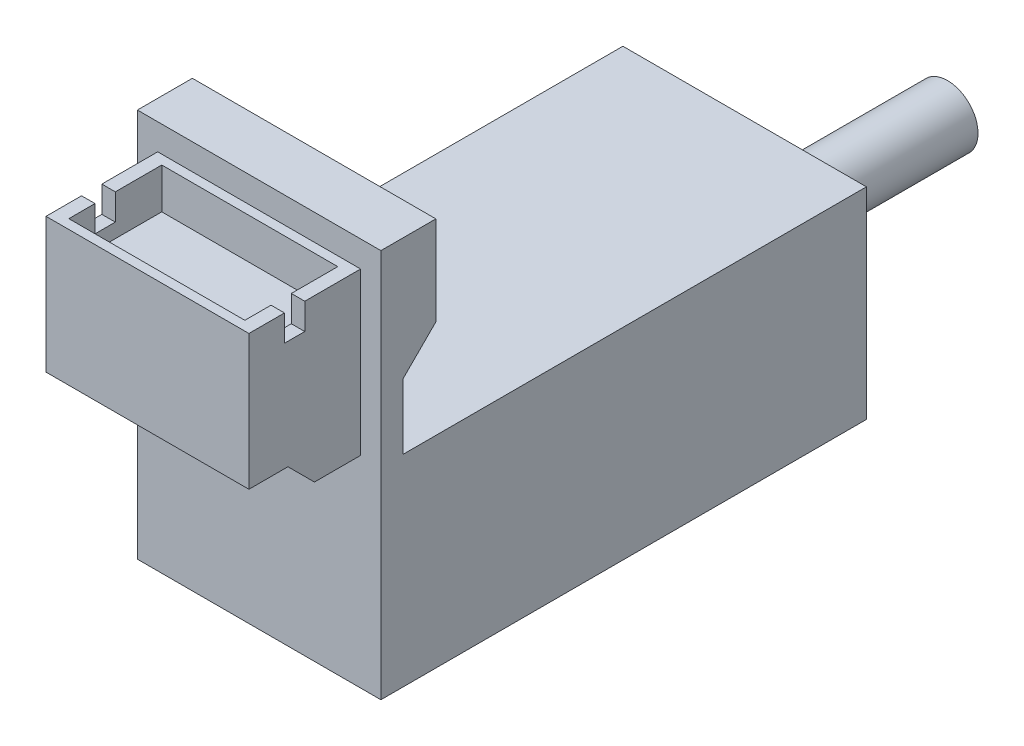
ISO-10303-21;
HEADER;
FILE_DESCRIPTION(('STEP AP214'),'2;1');
FILE_NAME('part.step','',(''),(''),'','','');
FILE_SCHEMA(('AUTOMOTIVE_DESIGN { 1 0 10303 214 1 1 1 1 }'));
ENDSEC;
DATA;
#1=APPLICATION_CONTEXT('core data for automotive mechanical design processes');
#2=APPLICATION_PROTOCOL_DEFINITION('international standard','automotive_design',2000,#1);
#3=PRODUCT_CONTEXT('',#1,'mechanical');
#4=PRODUCT('Part','Part','',(#3));
#5=PRODUCT_RELATED_PRODUCT_CATEGORY('part','',(#4));
#6=PRODUCT_DEFINITION_FORMATION('','',#4);
#7=PRODUCT_DEFINITION_CONTEXT('part definition',#1,'design');
#8=PRODUCT_DEFINITION('design','',#6,#7);
#9=PRODUCT_DEFINITION_SHAPE('','',#8);
#10=(LENGTH_UNIT() NAMED_UNIT(*) SI_UNIT(.MILLI.,.METRE.));
#11=(NAMED_UNIT(*) PLANE_ANGLE_UNIT() SI_UNIT($,.RADIAN.));
#12=(NAMED_UNIT(*) SI_UNIT($,.STERADIAN.) SOLID_ANGLE_UNIT());
#13=UNCERTAINTY_MEASURE_WITH_UNIT(LENGTH_MEASURE(1.E-05),#10,'distance_accuracy_value','');
#14=(GEOMETRIC_REPRESENTATION_CONTEXT(3) GLOBAL_UNCERTAINTY_ASSIGNED_CONTEXT((#13)) GLOBAL_UNIT_ASSIGNED_CONTEXT((#10,
#11,#12)) REPRESENTATION_CONTEXT('',''));
#15=CARTESIAN_POINT('',(0.,0.,0.));
#16=DIRECTION('',(0.,0.,1.));
#17=DIRECTION('',(1.,0.,0.));
#18=AXIS2_PLACEMENT_3D('',#15,#16,#17);
#19=CARTESIAN_POINT('',(0.,11.6277323625139,10.3020160923981));
#20=DIRECTION('',(0.,0.,-1.));
#21=DIRECTION('',(-1.,0.,0.));
#22=AXIS2_PLACEMENT_3D('',#19,#20,#21);
#23=PLANE('',#22);
#24=DIRECTION('',(1.,0.,0.));
#25=VECTOR('',#24,1.);
#26=CARTESIAN_POINT('',(0.,12.920980416334,10.3020160923981));
#27=LINE('',#26,#25);
#28=CARTESIAN_POINT('',(10.3374091666759,12.920980416334,10.3020160923981));
#29=VERTEX_POINT('',#28);
#30=CARTESIAN_POINT('',(11.,12.920980416334,10.3020160923981));
#31=VERTEX_POINT('',#30);
#32=EDGE_CURVE('E315',#29,#31,#27,.T.);
#33=ORIENTED_EDGE('',*,*,#32,.F.);
#34=DIRECTION('',(0.,-1.,0.));
#35=VECTOR('',#34,1.);
#36=CARTESIAN_POINT('',(10.3374091666759,11.6277323625139,10.3020160923981));
#37=LINE('',#36,#35);
#38=CARTESIAN_POINT('',(10.3374091666759,11.6277323625139,10.3020160923981));
#39=VERTEX_POINT('',#38);
#40=EDGE_CURVE('E295',#29,#39,#37,.T.);
#41=ORIENTED_EDGE('',*,*,#40,.T.);
#42=DIRECTION('',(1.,0.,0.));
#43=VECTOR('',#42,1.);
#44=CARTESIAN_POINT('',(0.,11.6277323625139,10.3020160923981));
#45=LINE('',#44,#43);
#46=CARTESIAN_POINT('',(11.,11.6277323625139,10.3020160923981));
#47=VERTEX_POINT('',#46);
#48=EDGE_CURVE('E320',#39,#47,#45,.T.);
#49=ORIENTED_EDGE('',*,*,#48,.T.);
#50=DIRECTION('',(0.,1.,0.));
#51=VECTOR('',#50,1.);
#52=CARTESIAN_POINT('',(11.,11.6277323625139,10.3020160923981));
#53=LINE('',#52,#51);
#54=EDGE_CURVE('E306',#47,#31,#53,.T.);
#55=ORIENTED_EDGE('',*,*,#54,.T.);
#56=EDGE_LOOP('',(#33,#41,#49,#55));
#57=FACE_BOUND('',#56,.T.);
#58=ADVANCED_FACE('F42',(#57),#23,.F.);
#59=CARTESIAN_POINT('',(0.,11.6277323625139,11.3020160923981));
#60=DIRECTION('',(0.,-1.,0.));
#61=DIRECTION('',(0.,0.,-1.));
#62=AXIS2_PLACEMENT_3D('',#59,#60,#61);
#63=PLANE('',#62);
#64=ORIENTED_EDGE('',*,*,#48,.F.);
#65=DIRECTION('',(0.,0.,1.));
#66=VECTOR('',#65,1.);
#67=CARTESIAN_POINT('',(10.3374091666759,11.6277323625139,11.3020160923981));
#68=LINE('',#67,#66);
#69=CARTESIAN_POINT('',(10.3374091666759,11.6277323625139,11.3020160923981));
#70=VERTEX_POINT('',#69);
#71=EDGE_CURVE('E291',#39,#70,#68,.T.);
#72=ORIENTED_EDGE('',*,*,#71,.T.);
#73=DIRECTION('',(1.,0.,0.));
#74=VECTOR('',#73,1.);
#75=CARTESIAN_POINT('',(0.,11.6277323625139,11.3020160923981));
#76=LINE('',#75,#74);
#77=CARTESIAN_POINT('',(11.,11.6277323625139,11.3020160923981));
#78=VERTEX_POINT('',#77);
#79=EDGE_CURVE('E325',#70,#78,#76,.T.);
#80=ORIENTED_EDGE('',*,*,#79,.T.);
#81=DIRECTION('',(0.,0.,-1.));
#82=VECTOR('',#81,1.);
#83=CARTESIAN_POINT('',(11.,11.6277323625139,11.3020160923981));
#84=LINE('',#83,#82);
#85=EDGE_CURVE('E302',#78,#47,#84,.T.);
#86=ORIENTED_EDGE('',*,*,#85,.T.);
#87=EDGE_LOOP('',(#64,#72,#80,#86));
#88=FACE_BOUND('',#87,.T.);
#89=ADVANCED_FACE('F586',(#88),#63,.F.);
#90=CARTESIAN_POINT('',(0.,12.920980416334,11.3020160923981));
#91=DIRECTION('',(0.,0.,1.));
#92=DIRECTION('',(1.,0.,0.));
#93=AXIS2_PLACEMENT_3D('',#90,#91,#92);
#94=PLANE('',#93);
#95=ORIENTED_EDGE('',*,*,#79,.F.);
#96=DIRECTION('',(0.,1.,0.));
#97=VECTOR('',#96,1.);
#98=CARTESIAN_POINT('',(10.3374091666759,12.920980416334,11.3020160923981));
#99=LINE('',#98,#97);
#100=CARTESIAN_POINT('',(10.3374091666759,12.920980416334,11.3020160923981));
#101=VERTEX_POINT('',#100);
#102=EDGE_CURVE('E11',#70,#101,#99,.T.);
#103=ORIENTED_EDGE('',*,*,#102,.T.);
#104=DIRECTION('',(1.,0.,0.));
#105=VECTOR('',#104,1.);
#106=CARTESIAN_POINT('',(0.,12.920980416334,11.3020160923981));
#107=LINE('',#106,#105);
#108=CARTESIAN_POINT('',(11.,12.920980416334,11.3020160923981));
#109=VERTEX_POINT('',#108);
#110=EDGE_CURVE('E65',#101,#109,#107,.T.);
#111=ORIENTED_EDGE('',*,*,#110,.T.);
#112=DIRECTION('',(0.,-1.,0.));
#113=VECTOR('',#112,1.);
#114=CARTESIAN_POINT('',(11.,12.920980416334,11.3020160923981));
#115=LINE('',#114,#113);
#116=EDGE_CURVE('E299',#109,#78,#115,.T.);
#117=ORIENTED_EDGE('',*,*,#116,.T.);
#118=EDGE_LOOP('',(#95,#103,#111,#117));
#119=FACE_BOUND('',#118,.T.);
#120=ADVANCED_FACE('F549',(#119),#94,.F.);
#121=CARTESIAN_POINT('',(12.,12.920980416334,13.0540321847962));
#122=DIRECTION('',(0.,-1.,0.));
#123=DIRECTION('',(0.,0.,-1.));
#124=AXIS2_PLACEMENT_3D('',#121,#122,#123);
#125=PLANE('',#124);
#126=DIRECTION('',(-1.,0.,0.));
#127=VECTOR('',#126,1.);
#128=CARTESIAN_POINT('',(1.66259083332411,12.920980416334,8.01171687796308));
#129=LINE('',#128,#127);
#130=CARTESIAN_POINT('',(10.3374091666759,12.920980416334,8.01171687796308));
#131=VERTEX_POINT('',#130);
#132=CARTESIAN_POINT('',(1.66259083332411,12.920980416334,8.01171687796308));
#133=VERTEX_POINT('',#132);
#134=EDGE_CURVE('E270',#131,#133,#129,.T.);
#135=ORIENTED_EDGE('',*,*,#134,.F.);
#136=DIRECTION('',(0.,0.,-1.));
#137=VECTOR('',#136,1.);
#138=CARTESIAN_POINT('',(10.3374091666759,12.920980416334,8.01171687796308));
#139=LINE('',#138,#137);
#140=EDGE_CURVE('E236',#29,#131,#139,.T.);
#141=ORIENTED_EDGE('',*,*,#140,.F.);
#142=ORIENTED_EDGE('',*,*,#32,.T.);
#143=DIRECTION('',(0.,0.,1.));
#144=VECTOR('',#143,1.);
#145=CARTESIAN_POINT('',(11.,12.920980416334,7.55));
#146=LINE('',#145,#144);
#147=CARTESIAN_POINT('',(11.,12.920980416334,7.55));
#148=VERTEX_POINT('',#147);
#149=EDGE_CURVE('E342',#148,#31,#146,.T.);
#150=ORIENTED_EDGE('',*,*,#149,.F.);
#151=DIRECTION('',(-1.,0.,0.));
#152=VECTOR('',#151,1.);
#153=CARTESIAN_POINT('',(12.,12.920980416334,7.55));
#154=LINE('',#153,#152);
#155=CARTESIAN_POINT('',(1.,12.920980416334,7.55));
#156=VERTEX_POINT('',#155);
#157=EDGE_CURVE('E495',#148,#156,#154,.T.);
#158=ORIENTED_EDGE('',*,*,#157,.T.);
#159=DIRECTION('',(0.,0.,-1.));
#160=VECTOR('',#159,1.);
#161=CARTESIAN_POINT('',(1.,12.920980416334,13.0540321847962));
#162=LINE('',#161,#160);
#163=CARTESIAN_POINT('',(1.,12.920980416334,10.3020160923981));
#164=VERTEX_POINT('',#163);
#165=EDGE_CURVE('E358',#164,#156,#162,.T.);
#166=ORIENTED_EDGE('',*,*,#165,.F.);
#167=CARTESIAN_POINT('',(1.66259083332411,12.920980416334,10.3020160923981));
#168=VERTEX_POINT('',#167);
#169=EDGE_CURVE('E310',#164,#168,#27,.T.);
#170=ORIENTED_EDGE('',*,*,#169,.T.);
#171=DIRECTION('',(0.,0.,1.));
#172=VECTOR('',#171,1.);
#173=CARTESIAN_POINT('',(1.66259083332411,12.920980416334,8.01171687796308));
#174=LINE('',#173,#172);
#175=EDGE_CURVE('E260',#133,#168,#174,.T.);
#176=ORIENTED_EDGE('',*,*,#175,.F.);
#177=EDGE_LOOP('',(#135,#141,#142,#150,#158,#166,#170,#176));
#178=FACE_BOUND('',#177,.T.);
#179=ADVANCED_FACE('F580',(#178),#125,.F.);
#180=CARTESIAN_POINT('',(12.,4.965,-16.3759678152038));
#181=DIRECTION('',(0.,0.,1.));
#182=DIRECTION('',(1.,0.,0.));
#183=AXIS2_PLACEMENT_3D('',#180,#181,#182);
#184=PLANE('',#183);
#185=CARTESIAN_POINT('',(6.,0.,-16.3759678152038));
#186=DIRECTION('',(0.,0.,-1.));
#187=DIRECTION('',(-1.,0.,0.));
#188=AXIS2_PLACEMENT_3D('',#185,#186,#187);
#189=CIRCLE('',#188,2.);
#190=CARTESIAN_POINT('',(4.,0.,-16.3759678152038));
#191=VERTEX_POINT('',#190);
#192=EDGE_CURVE('E412',#191,#191,#189,.T.);
#193=ORIENTED_EDGE('',*,*,#192,.F.);
#194=EDGE_LOOP('',(#193));
#195=FACE_BOUND('',#194,.T.);
#196=DIRECTION('',(0.,1.,0.));
#197=VECTOR('',#196,1.);
#198=CARTESIAN_POINT('',(0.,4.965,-16.3759678152038));
#199=LINE('',#198,#197);
#200=CARTESIAN_POINT('',(0.,-4.965,-16.3759678152038));
#201=VERTEX_POINT('',#200);
#202=CARTESIAN_POINT('',(0.,4.965,-16.3759678152038));
#203=VERTEX_POINT('',#202);
#204=EDGE_CURVE('E416',#201,#203,#199,.T.);
#205=ORIENTED_EDGE('',*,*,#204,.T.);
#206=DIRECTION('',(-1.,0.,0.));
#207=VECTOR('',#206,1.);
#208=CARTESIAN_POINT('',(12.,4.965,-16.3759678152038));
#209=LINE('',#208,#207);
#210=CARTESIAN_POINT('',(12.,4.965,-16.3759678152038));
#211=VERTEX_POINT('',#210);
#212=EDGE_CURVE('E519',#211,#203,#209,.T.);
#213=ORIENTED_EDGE('',*,*,#212,.F.);
#214=DIRECTION('',(0.,1.,0.));
#215=VECTOR('',#214,1.);
#216=CARTESIAN_POINT('',(12.,4.965,-16.3759678152038));
#217=LINE('',#216,#215);
#218=CARTESIAN_POINT('',(12.,-4.965,-16.3759678152038));
#219=VERTEX_POINT('',#218);
#220=EDGE_CURVE('E425',#219,#211,#217,.T.);
#221=ORIENTED_EDGE('',*,*,#220,.F.);
#222=DIRECTION('',(-1.,0.,0.));
#223=VECTOR('',#222,1.);
#224=CARTESIAN_POINT('',(12.,-4.965,-16.3759678152038));
#225=LINE('',#224,#223);
#226=EDGE_CURVE('E420',#219,#201,#225,.T.);
#227=ORIENTED_EDGE('',*,*,#226,.T.);
#228=EDGE_LOOP('',(#205,#213,#221,#227));
#229=FACE_BOUND('',#228,.T.);
#230=ADVANCED_FACE('F44',(#195,#229),#184,.F.);
#231=CARTESIAN_POINT('',(12.,4.965,-7.57596781520379));
#232=DIRECTION('',(0.,-1.,0.));
#233=DIRECTION('',(0.,0.,-1.));
#234=AXIS2_PLACEMENT_3D('',#231,#232,#233);
#235=PLANE('',#234);
#236=DIRECTION('',(0.,0.,1.));
#237=VECTOR('',#236,1.);
#238=CARTESIAN_POINT('',(0.,4.965,-7.57596781520379));
#239=LINE('',#238,#237);
#240=CARTESIAN_POINT('',(0.,4.965,6.46289635030632));
#241=VERTEX_POINT('',#240);
#242=EDGE_CURVE('E451',#203,#241,#239,.T.);
#243=ORIENTED_EDGE('',*,*,#242,.T.);
#244=DIRECTION('',(-1.,0.,0.));
#245=VECTOR('',#244,1.);
#246=CARTESIAN_POINT('',(12.,4.965,6.46289635030632));
#247=LINE('',#246,#245);
#248=CARTESIAN_POINT('',(12.,4.965,6.46289635030632));
#249=VERTEX_POINT('',#248);
#250=EDGE_CURVE('E515',#249,#241,#247,.T.);
#251=ORIENTED_EDGE('',*,*,#250,.F.);
#252=DIRECTION('',(0.,0.,1.));
#253=VECTOR('',#252,1.);
#254=CARTESIAN_POINT('',(12.,4.965,-7.57596781520379));
#255=LINE('',#254,#253);
#256=EDGE_CURVE('E429',#211,#249,#255,.T.);
#257=ORIENTED_EDGE('',*,*,#256,.F.);
#258=ORIENTED_EDGE('',*,*,#212,.T.);
#259=EDGE_LOOP('',(#243,#251,#257,#258));
#260=FACE_BOUND('',#259,.T.);
#261=ADVANCED_FACE('F669',(#260),#235,.F.);
#262=CARTESIAN_POINT('',(12.,4.965,6.46289635030632));
#263=DIRECTION('',(0.,0.,1.));
#264=DIRECTION('',(1.,0.,0.));
#265=AXIS2_PLACEMENT_3D('',#262,#263,#264);
#266=PLANE('',#265);
#267=DIRECTION('',(0.,1.,0.));
#268=VECTOR('',#267,1.);
#269=CARTESIAN_POINT('',(0.,4.965,6.46289635030632));
#270=LINE('',#269,#268);
#271=CARTESIAN_POINT('',(0.,8.18726359725133,6.46289635030632));
#272=VERTEX_POINT('',#271);
#273=EDGE_CURVE('E454',#241,#272,#270,.T.);
#274=ORIENTED_EDGE('',*,*,#273,.T.);
#275=DIRECTION('',(-1.,0.,0.));
#276=VECTOR('',#275,1.);
#277=CARTESIAN_POINT('',(12.,8.18726359725133,6.46289635030632));
#278=LINE('',#277,#276);
#279=CARTESIAN_POINT('',(12.,8.18726359725133,6.46289635030632));
#280=VERTEX_POINT('',#279);
#281=EDGE_CURVE('E511',#280,#272,#278,.T.);
#282=ORIENTED_EDGE('',*,*,#281,.F.);
#283=DIRECTION('',(0.,1.,0.));
#284=VECTOR('',#283,1.);
#285=CARTESIAN_POINT('',(12.,4.965,6.46289635030632));
#286=LINE('',#285,#284);
#287=EDGE_CURVE('E432',#249,#280,#286,.T.);
#288=ORIENTED_EDGE('',*,*,#287,.F.);
#289=ORIENTED_EDGE('',*,*,#250,.T.);
#290=EDGE_LOOP('',(#274,#282,#288,#289));
#291=FACE_BOUND('',#290,.T.);
#292=ADVANCED_FACE('F666',(#291),#266,.F.);
#293=CARTESIAN_POINT('',(12.,8.18726359725133,6.46289635030632));
#294=DIRECTION('',(0.,0.707106781186548,0.707106781186548));
#295=DIRECTION('',(0.,-0.707106781186548,0.707106781186548));
#296=AXIS2_PLACEMENT_3D('',#293,#294,#295);
#297=PLANE('',#296);
#298=DIRECTION('',(0.,0.707106781186547,-0.707106781186547));
#299=VECTOR('',#298,1.);
#300=CARTESIAN_POINT('',(0.,8.18726359725133,6.46289635030632));
#301=LINE('',#300,#299);
#302=CARTESIAN_POINT('',(0.,9.80926167369616,4.84089827386149));
#303=VERTEX_POINT('',#302);
#304=EDGE_CURVE('E457',#272,#303,#301,.T.);
#305=ORIENTED_EDGE('',*,*,#304,.T.);
#306=DIRECTION('',(-1.,0.,0.));
#307=VECTOR('',#306,1.);
#308=CARTESIAN_POINT('',(12.,9.80926167369616,4.84089827386149));
#309=LINE('',#308,#307);
#310=CARTESIAN_POINT('',(12.,9.80926167369616,4.84089827386149));
#311=VERTEX_POINT('',#310);
#312=EDGE_CURVE('E507',#311,#303,#309,.T.);
#313=ORIENTED_EDGE('',*,*,#312,.F.);
#314=DIRECTION('',(0.,0.707106781186547,-0.707106781186547));
#315=VECTOR('',#314,1.);
#316=CARTESIAN_POINT('',(12.,8.18726359725133,6.46289635030632));
#317=LINE('',#316,#315);
#318=EDGE_CURVE('E435',#280,#311,#317,.T.);
#319=ORIENTED_EDGE('',*,*,#318,.F.);
#320=ORIENTED_EDGE('',*,*,#281,.T.);
#321=EDGE_LOOP('',(#305,#313,#319,#320));
#322=FACE_BOUND('',#321,.T.);
#323=ADVANCED_FACE('F662',(#322),#297,.F.);
#324=CARTESIAN_POINT('',(12.,9.80926167369616,4.84089827386149));
#325=DIRECTION('',(0.,0.,1.));
#326=DIRECTION('',(0.,-1.,0.));
#327=AXIS2_PLACEMENT_3D('',#324,#325,#326);
#328=PLANE('',#327);
#329=DIRECTION('',(0.,1.,0.));
#330=VECTOR('',#329,1.);
#331=CARTESIAN_POINT('',(0.,9.80926167369616,4.84089827386149));
#332=LINE('',#331,#330);
#333=CARTESIAN_POINT('',(0.,14.205,4.84089827386148));
#334=VERTEX_POINT('',#333);
#335=EDGE_CURVE('E460',#303,#334,#332,.T.);
#336=ORIENTED_EDGE('',*,*,#335,.T.);
#337=DIRECTION('',(-1.,0.,0.));
#338=VECTOR('',#337,1.);
#339=CARTESIAN_POINT('',(12.,14.205,4.84089827386148));
#340=LINE('',#339,#338);
#341=CARTESIAN_POINT('',(12.,14.205,4.84089827386148));
#342=VERTEX_POINT('',#341);
#343=EDGE_CURVE('E503',#342,#334,#340,.T.);
#344=ORIENTED_EDGE('',*,*,#343,.F.);
#345=DIRECTION('',(0.,1.,0.));
#346=VECTOR('',#345,1.);
#347=CARTESIAN_POINT('',(12.,9.80926167369616,4.84089827386149));
#348=LINE('',#347,#346);
#349=EDGE_CURVE('E438',#311,#342,#348,.T.);
#350=ORIENTED_EDGE('',*,*,#349,.F.);
#351=ORIENTED_EDGE('',*,*,#312,.T.);
#352=EDGE_LOOP('',(#336,#344,#350,#351));
#353=FACE_BOUND('',#352,.T.);
#354=ADVANCED_FACE('F658',(#353),#328,.F.);
#355=CARTESIAN_POINT('',(12.,14.205,4.84089827386148));
#356=DIRECTION('',(0.,-1.,0.));
#357=DIRECTION('',(0.,0.,-1.));
#358=AXIS2_PLACEMENT_3D('',#355,#356,#357);
#359=PLANE('',#358);
#360=DIRECTION('',(0.,0.,1.));
#361=VECTOR('',#360,1.);
#362=CARTESIAN_POINT('',(0.,14.205,4.84089827386148));
#363=LINE('',#362,#361);
#364=CARTESIAN_POINT('',(0.,14.205,7.55));
#365=VERTEX_POINT('',#364);
#366=EDGE_CURVE('E463',#334,#365,#363,.T.);
#367=ORIENTED_EDGE('',*,*,#366,.T.);
#368=DIRECTION('',(-1.,0.,0.));
#369=VECTOR('',#368,1.);
#370=CARTESIAN_POINT('',(12.,14.205,7.55));
#371=LINE('',#370,#369);
#372=CARTESIAN_POINT('',(12.,14.205,7.55));
#373=VERTEX_POINT('',#372);
#374=EDGE_CURVE('E499',#373,#365,#371,.T.);
#375=ORIENTED_EDGE('',*,*,#374,.F.);
#376=DIRECTION('',(0.,0.,1.));
#377=VECTOR('',#376,1.);
#378=CARTESIAN_POINT('',(12.,14.205,4.84089827386148));
#379=LINE('',#378,#377);
#380=EDGE_CURVE('E441',#342,#373,#379,.T.);
#381=ORIENTED_EDGE('',*,*,#380,.F.);
#382=ORIENTED_EDGE('',*,*,#343,.T.);
#383=EDGE_LOOP('',(#367,#375,#381,#382));
#384=FACE_BOUND('',#383,.T.);
#385=ADVANCED_FACE('F655',(#384),#359,.F.);
#386=ORIENTED_EDGE('',*,*,#110,.F.);
#387=CARTESIAN_POINT('',(10.3374091666759,12.920980416334,12.5923153068331));
#388=VERTEX_POINT('',#387);
#389=EDGE_CURVE('E267',#388,#101,#139,.T.);
#390=ORIENTED_EDGE('',*,*,#389,.F.);
#391=DIRECTION('',(1.,0.,0.));
#392=VECTOR('',#391,1.);
#393=CARTESIAN_POINT('',(1.66259083332411,12.920980416334,12.5923153068331));
#394=LINE('',#393,#392);
#395=CARTESIAN_POINT('',(1.66259083332411,12.920980416334,12.5923153068331));
#396=VERTEX_POINT('',#395);
#397=EDGE_CURVE('E256',#396,#388,#394,.T.);
#398=ORIENTED_EDGE('',*,*,#397,.F.);
#399=CARTESIAN_POINT('',(1.66259083332411,12.920980416334,11.3020160923981));
#400=VERTEX_POINT('',#399);
#401=EDGE_CURVE('E273',#400,#396,#174,.T.);
#402=ORIENTED_EDGE('',*,*,#401,.F.);
#403=CARTESIAN_POINT('',(1.,12.920980416334,11.3020160923981));
#404=VERTEX_POINT('',#403);
#405=EDGE_CURVE('E326',#404,#400,#107,.T.);
#406=ORIENTED_EDGE('',*,*,#405,.F.);
#407=CARTESIAN_POINT('',(1.,12.920980416334,13.0540321847962));
#408=VERTEX_POINT('',#407);
#409=EDGE_CURVE('E362',#408,#404,#162,.T.);
#410=ORIENTED_EDGE('',*,*,#409,.F.);
#411=DIRECTION('',(-1.,0.,0.));
#412=VECTOR('',#411,1.);
#413=CARTESIAN_POINT('',(12.,12.920980416334,13.0540321847962));
#414=LINE('',#413,#412);
#415=CARTESIAN_POINT('',(11.,12.920980416334,13.0540321847962));
#416=VERTEX_POINT('',#415);
#417=EDGE_CURVE('E491',#416,#408,#414,.T.);
#418=ORIENTED_EDGE('',*,*,#417,.F.);
#419=EDGE_CURVE('E347',#109,#416,#146,.T.);
#420=ORIENTED_EDGE('',*,*,#419,.F.);
#421=EDGE_LOOP('',(#386,#390,#398,#402,#406,#410,#418,#420));
#422=FACE_BOUND('',#421,.T.);
#423=ADVANCED_FACE('F539',(#422),#125,.F.);
#424=CARTESIAN_POINT('',(12.,6.27082213141473,13.0540321847962));
#425=DIRECTION('',(0.,0.,-1.));
#426=DIRECTION('',(-1.,0.,0.));
#427=AXIS2_PLACEMENT_3D('',#424,#425,#426);
#428=PLANE('',#427);
#429=DIRECTION('',(-1.,0.,0.));
#430=VECTOR('',#429,1.);
#431=CARTESIAN_POINT('',(12.,6.27082213141473,13.0540321847962));
#432=LINE('',#431,#430);
#433=CARTESIAN_POINT('',(11.,6.27082213141473,13.0540321847962));
#434=VERTEX_POINT('',#433);
#435=CARTESIAN_POINT('',(1.,6.27082213141473,13.0540321847962));
#436=VERTEX_POINT('',#435);
#437=EDGE_CURVE('E487',#434,#436,#432,.T.);
#438=ORIENTED_EDGE('',*,*,#437,.F.);
#439=DIRECTION('',(0.,1.,0.));
#440=VECTOR('',#439,1.);
#441=CARTESIAN_POINT('',(11.,-4.965,13.0540321847962));
#442=LINE('',#441,#440);
#443=EDGE_CURVE('E348',#434,#416,#442,.T.);
#444=ORIENTED_EDGE('',*,*,#443,.T.);
#445=ORIENTED_EDGE('',*,*,#417,.T.);
#446=DIRECTION('',(0.,1.,0.));
#447=VECTOR('',#446,1.);
#448=CARTESIAN_POINT('',(1.,-4.965,13.0540321847962));
#449=LINE('',#448,#447);
#450=EDGE_CURVE('E355',#436,#408,#449,.T.);
#451=ORIENTED_EDGE('',*,*,#450,.F.);
#452=EDGE_LOOP('',(#438,#444,#445,#451));
#453=FACE_BOUND('',#452,.T.);
#454=ADVANCED_FACE('F562',(#453),#428,.F.);
#455=CARTESIAN_POINT('',(12.,6.27082213141473,11.1309689677345));
#456=DIRECTION('',(0.,1.,0.));
#457=DIRECTION('',(0.,0.,1.));
#458=AXIS2_PLACEMENT_3D('',#455,#456,#457);
#459=PLANE('',#458);
#460=DIRECTION('',(-1.,0.,0.));
#461=VECTOR('',#460,1.);
#462=CARTESIAN_POINT('',(12.,6.27082213141473,11.1309689677345));
#463=LINE('',#462,#461);
#464=CARTESIAN_POINT('',(11.,6.27082213141473,11.1309689677345));
#465=VERTEX_POINT('',#464);
#466=CARTESIAN_POINT('',(1.,6.27082213141473,11.1309689677345));
#467=VERTEX_POINT('',#466);
#468=EDGE_CURVE('E483',#465,#467,#463,.T.);
#469=ORIENTED_EDGE('',*,*,#468,.F.);
#470=DIRECTION('',(0.,0.,1.));
#471=VECTOR('',#470,1.);
#472=CARTESIAN_POINT('',(11.,6.27082213141473,11.1309689677345));
#473=LINE('',#472,#471);
#474=EDGE_CURVE('E385',#465,#434,#473,.T.);
#475=ORIENTED_EDGE('',*,*,#474,.T.);
#476=ORIENTED_EDGE('',*,*,#437,.T.);
#477=DIRECTION('',(0.,0.,-1.));
#478=VECTOR('',#477,1.);
#479=CARTESIAN_POINT('',(1.,6.27082213141473,11.1309689677345));
#480=LINE('',#479,#478);
#481=EDGE_CURVE('E373',#436,#467,#480,.T.);
#482=ORIENTED_EDGE('',*,*,#481,.T.);
#483=EDGE_LOOP('',(#469,#475,#476,#482));
#484=FACE_BOUND('',#483,.T.);
#485=ADVANCED_FACE('F566',(#484),#459,.F.);
#486=CARTESIAN_POINT('',(12.,4.965,9.82514683631977));
#487=DIRECTION('',(0.,0.707106781186548,-0.707106781186548));
#488=DIRECTION('',(0.,0.707106781186548,0.707106781186548));
#489=AXIS2_PLACEMENT_3D('',#486,#487,#488);
#490=PLANE('',#489);
#491=DIRECTION('',(-1.,0.,0.));
#492=VECTOR('',#491,1.);
#493=CARTESIAN_POINT('',(12.,4.965,9.82514683631977));
#494=LINE('',#493,#492);
#495=CARTESIAN_POINT('',(11.,4.965,9.82514683631977));
#496=VERTEX_POINT('',#495);
#497=CARTESIAN_POINT('',(1.,4.965,9.82514683631977));
#498=VERTEX_POINT('',#497);
#499=EDGE_CURVE('E479',#496,#498,#494,.T.);
#500=ORIENTED_EDGE('',*,*,#499,.F.);
#501=DIRECTION('',(0.,0.707106781186548,0.707106781186548));
#502=VECTOR('',#501,1.);
#503=CARTESIAN_POINT('',(11.,4.965,9.82514683631977));
#504=LINE('',#503,#502);
#505=EDGE_CURVE('E381',#496,#465,#504,.T.);
#506=ORIENTED_EDGE('',*,*,#505,.T.);
#507=ORIENTED_EDGE('',*,*,#468,.T.);
#508=DIRECTION('',(0.,-0.707106781186548,-0.707106781186548));
#509=VECTOR('',#508,1.);
#510=CARTESIAN_POINT('',(1.,4.965,9.82514683631977));
#511=LINE('',#510,#509);
#512=EDGE_CURVE('E369',#467,#498,#511,.T.);
#513=ORIENTED_EDGE('',*,*,#512,.T.);
#514=EDGE_LOOP('',(#500,#506,#507,#513));
#515=FACE_BOUND('',#514,.T.);
#516=ADVANCED_FACE('F569',(#515),#490,.F.);
#517=CARTESIAN_POINT('',(12.,4.965,7.55));
#518=DIRECTION('',(0.,1.,0.));
#519=DIRECTION('',(0.,0.,1.));
#520=AXIS2_PLACEMENT_3D('',#517,#518,#519);
#521=PLANE('',#520);
#522=DIRECTION('',(-1.,0.,0.));
#523=VECTOR('',#522,1.);
#524=CARTESIAN_POINT('',(12.,4.965,7.55));
#525=LINE('',#524,#523);
#526=CARTESIAN_POINT('',(11.,4.965,7.55));
#527=VERTEX_POINT('',#526);
#528=CARTESIAN_POINT('',(1.,4.965,7.55));
#529=VERTEX_POINT('',#528);
#530=EDGE_CURVE('E475',#527,#529,#525,.T.);
#531=ORIENTED_EDGE('',*,*,#530,.F.);
#532=DIRECTION('',(0.,0.,1.));
#533=VECTOR('',#532,1.);
#534=CARTESIAN_POINT('',(11.,4.965,7.55));
#535=LINE('',#534,#533);
#536=EDGE_CURVE('E377',#527,#496,#535,.T.);
#537=ORIENTED_EDGE('',*,*,#536,.T.);
#538=ORIENTED_EDGE('',*,*,#499,.T.);
#539=DIRECTION('',(0.,0.,-1.));
#540=VECTOR('',#539,1.);
#541=CARTESIAN_POINT('',(1.,4.965,7.55));
#542=LINE('',#541,#540);
#543=EDGE_CURVE('E352',#498,#529,#542,.T.);
#544=ORIENTED_EDGE('',*,*,#543,.T.);
#545=EDGE_LOOP('',(#531,#537,#538,#544));
#546=FACE_BOUND('',#545,.T.);
#547=ADVANCED_FACE('F572',(#546),#521,.F.);
#548=CARTESIAN_POINT('',(12.,-4.965,7.55));
#549=DIRECTION('',(0.,0.,-1.));
#550=DIRECTION('',(0.,1.,0.));
#551=AXIS2_PLACEMENT_3D('',#548,#549,#550);
#552=PLANE('',#551);
#553=ORIENTED_EDGE('',*,*,#157,.F.);
#554=DIRECTION('',(0.,1.,0.));
#555=VECTOR('',#554,1.);
#556=CARTESIAN_POINT('',(11.,-4.965,7.55));
#557=LINE('',#556,#555);
#558=EDGE_CURVE('E346',#527,#148,#557,.T.);
#559=ORIENTED_EDGE('',*,*,#558,.F.);
#560=ORIENTED_EDGE('',*,*,#530,.T.);
#561=DIRECTION('',(0.,1.,0.));
#562=VECTOR('',#561,1.);
#563=CARTESIAN_POINT('',(1.,-4.965,7.55));
#564=LINE('',#563,#562);
#565=EDGE_CURVE('E341',#529,#156,#564,.T.);
#566=ORIENTED_EDGE('',*,*,#565,.T.);
#567=EDGE_LOOP('',(#553,#559,#560,#566));
#568=FACE_BOUND('',#567,.T.);
#569=DIRECTION('',(0.,-1.,0.));
#570=VECTOR('',#569,1.);
#571=CARTESIAN_POINT('',(0.,-4.965,7.55));
#572=LINE('',#571,#570);
#573=CARTESIAN_POINT('',(0.,-4.965,7.55));
#574=VERTEX_POINT('',#573);
#575=EDGE_CURVE('E467',#365,#574,#572,.T.);
#576=ORIENTED_EDGE('',*,*,#575,.T.);
#577=DIRECTION('',(-1.,0.,0.));
#578=VECTOR('',#577,1.);
#579=CARTESIAN_POINT('',(12.,-4.965,7.55));
#580=LINE('',#579,#578);
#581=CARTESIAN_POINT('',(12.,-4.965,7.55));
#582=VERTEX_POINT('',#581);
#583=EDGE_CURVE('E447',#582,#574,#580,.T.);
#584=ORIENTED_EDGE('',*,*,#583,.F.);
#585=DIRECTION('',(0.,-1.,0.));
#586=VECTOR('',#585,1.);
#587=CARTESIAN_POINT('',(12.,14.205,7.55));
#588=LINE('',#587,#586);
#589=EDGE_CURVE('E444',#373,#582,#588,.T.);
#590=ORIENTED_EDGE('',*,*,#589,.F.);
#591=ORIENTED_EDGE('',*,*,#374,.T.);
#592=EDGE_LOOP('',(#576,#584,#590,#591));
#593=FACE_BOUND('',#592,.T.);
#594=ADVANCED_FACE('F577',(#568,#593),#552,.F.);
#595=CARTESIAN_POINT('',(12.,-4.965,7.55));
#596=DIRECTION('',(0.,1.,0.));
#597=DIRECTION('',(0.,0.,1.));
#598=AXIS2_PLACEMENT_3D('',#595,#596,#597);
#599=PLANE('',#598);
#600=DIRECTION('',(0.,0.,-1.));
#601=VECTOR('',#600,1.);
#602=CARTESIAN_POINT('',(0.,-4.965,7.55));
#603=LINE('',#602,#601);
#604=EDGE_CURVE('E426',#574,#201,#603,.T.);
#605=ORIENTED_EDGE('',*,*,#604,.T.);
#606=ORIENTED_EDGE('',*,*,#226,.F.);
#607=DIRECTION('',(0.,0.,-1.));
#608=VECTOR('',#607,1.);
#609=CARTESIAN_POINT('',(12.,-4.965,-16.3759678152038));
#610=LINE('',#609,#608);
#611=EDGE_CURVE('E421',#582,#219,#610,.T.);
#612=ORIENTED_EDGE('',*,*,#611,.F.);
#613=ORIENTED_EDGE('',*,*,#583,.T.);
#614=EDGE_LOOP('',(#605,#606,#612,#613));
#615=FACE_BOUND('',#614,.T.);
#616=ADVANCED_FACE('F635',(#615),#599,.F.);
#617=CARTESIAN_POINT('',(12.,0.,0.));
#618=DIRECTION('',(-1.,0.,0.));
#619=DIRECTION('',(0.,0.,1.));
#620=AXIS2_PLACEMENT_3D('',#617,#618,#619);
#621=PLANE('',#620);
#622=ORIENTED_EDGE('',*,*,#589,.T.);
#623=ORIENTED_EDGE('',*,*,#611,.T.);
#624=ORIENTED_EDGE('',*,*,#220,.T.);
#625=ORIENTED_EDGE('',*,*,#256,.T.);
#626=ORIENTED_EDGE('',*,*,#287,.T.);
#627=ORIENTED_EDGE('',*,*,#318,.T.);
#628=ORIENTED_EDGE('',*,*,#349,.T.);
#629=ORIENTED_EDGE('',*,*,#380,.T.);
#630=EDGE_LOOP('',(#622,#623,#624,#625,#626,#627,#628,#629));
#631=FACE_BOUND('',#630,.T.);
#632=ADVANCED_FACE('F632',(#631),#621,.F.);
#633=CARTESIAN_POINT('',(0.,0.,0.));
#634=DIRECTION('',(-1.,0.,0.));
#635=DIRECTION('',(0.,0.,1.));
#636=AXIS2_PLACEMENT_3D('',#633,#634,#635);
#637=PLANE('',#636);
#638=ORIENTED_EDGE('',*,*,#575,.F.);
#639=ORIENTED_EDGE('',*,*,#366,.F.);
#640=ORIENTED_EDGE('',*,*,#335,.F.);
#641=ORIENTED_EDGE('',*,*,#304,.F.);
#642=ORIENTED_EDGE('',*,*,#273,.F.);
#643=ORIENTED_EDGE('',*,*,#242,.F.);
#644=ORIENTED_EDGE('',*,*,#204,.F.);
#645=ORIENTED_EDGE('',*,*,#604,.F.);
#646=EDGE_LOOP('',(#638,#639,#640,#641,#642,#643,#644,#645));
#647=FACE_BOUND('',#646,.T.);
#648=ADVANCED_FACE('F630',(#647),#637,.T.);
#649=CARTESIAN_POINT('',(6.,0.,-17.3759678152038));
#650=DIRECTION('',(0.,0.,1.));
#651=DIRECTION('',(1.,0.,0.));
#652=AXIS2_PLACEMENT_3D('',#649,#650,#651);
#653=CYLINDRICAL_SURFACE('',#652,2.);
#654=CARTESIAN_POINT('',(6.,0.,-17.3759678152038));
#655=DIRECTION('',(0.,0.,-1.));
#656=DIRECTION('',(-1.,0.,0.));
#657=AXIS2_PLACEMENT_3D('',#654,#655,#656);
#658=CIRCLE('',#657,2.);
#659=CARTESIAN_POINT('',(4.,0.,-17.3759678152038));
#660=VERTEX_POINT('',#659);
#661=EDGE_CURVE('E407',#660,#660,#658,.T.);
#662=ORIENTED_EDGE('',*,*,#661,.F.);
#663=EDGE_LOOP('',(#662));
#664=FACE_BOUND('',#663,.T.);
#665=ORIENTED_EDGE('',*,*,#192,.T.);
#666=EDGE_LOOP('',(#665));
#667=FACE_BOUND('',#666,.T.);
#668=ADVANCED_FACE('F626',(#664,#667),#653,.T.);
#669=CARTESIAN_POINT('',(6.,0.,-17.3759678152038));
#670=DIRECTION('',(0.,0.,-1.));
#671=DIRECTION('',(-1.,0.,0.));
#672=AXIS2_PLACEMENT_3D('',#669,#670,#671);
#673=PLANE('',#672);
#674=CARTESIAN_POINT('',(6.,0.,-17.3759678152038));
#675=DIRECTION('',(0.,0.,-1.));
#676=DIRECTION('',(-1.,0.,0.));
#677=AXIS2_PLACEMENT_3D('',#674,#675,#676);
#678=CIRCLE('',#677,1.5);
#679=CARTESIAN_POINT('',(5.16015448241879,-1.24284331538563,-17.3759678152038));
#680=VERTEX_POINT('',#679);
#681=CARTESIAN_POINT('',(6.83984551758121,-1.24284331538563,-17.3759678152038));
#682=VERTEX_POINT('',#681);
#683=EDGE_CURVE('E408',#680,#682,#678,.T.);
#684=ORIENTED_EDGE('',*,*,#683,.F.);
#685=DIRECTION('',(1.,0.,0.));
#686=VECTOR('',#685,1.);
#687=CARTESIAN_POINT('',(6.83984551758121,-1.24284331538563,-17.3759678152038));
#688=LINE('',#687,#686);
#689=EDGE_CURVE('E390',#680,#682,#688,.T.);
#690=ORIENTED_EDGE('',*,*,#689,.T.);
#691=EDGE_LOOP('',(#684,#690));
#692=FACE_BOUND('',#691,.T.);
#693=ORIENTED_EDGE('',*,*,#661,.T.);
#694=EDGE_LOOP('',(#693));
#695=FACE_BOUND('',#694,.T.);
#696=ADVANCED_FACE('F622',(#692,#695),#673,.T.);
#697=CARTESIAN_POINT('',(6.,0.,-26.3759678152038));
#698=DIRECTION('',(0.,0.,1.));
#699=DIRECTION('',(1.,0.,0.));
#700=AXIS2_PLACEMENT_3D('',#697,#698,#699);
#701=CYLINDRICAL_SURFACE('',#700,1.5);
#702=CARTESIAN_POINT('',(6.,0.,-26.3759678152038));
#703=DIRECTION('',(0.,0.,-1.));
#704=DIRECTION('',(-1.,0.,0.));
#705=AXIS2_PLACEMENT_3D('',#702,#703,#704);
#706=CIRCLE('',#705,1.5);
#707=CARTESIAN_POINT('',(5.16015448241879,-1.24284331538563,-26.3759678152038));
#708=VERTEX_POINT('',#707);
#709=CARTESIAN_POINT('',(6.83984551758121,-1.24284331538563,-26.3759678152038));
#710=VERTEX_POINT('',#709);
#711=EDGE_CURVE('E401',#708,#710,#706,.T.);
#712=ORIENTED_EDGE('',*,*,#711,.F.);
#713=DIRECTION('',(0.,0.,-1.));
#714=VECTOR('',#713,1.);
#715=CARTESIAN_POINT('',(5.16015448241879,-1.24284331538563,-17.3759678152038));
#716=LINE('',#715,#714);
#717=EDGE_CURVE('E394',#680,#708,#716,.T.);
#718=ORIENTED_EDGE('',*,*,#717,.F.);
#719=ORIENTED_EDGE('',*,*,#683,.T.);
#720=DIRECTION('',(0.,0.,-1.));
#721=VECTOR('',#720,1.);
#722=CARTESIAN_POINT('',(6.83984551758121,-1.24284331538563,-17.3759678152038));
#723=LINE('',#722,#721);
#724=EDGE_CURVE('E397',#682,#710,#723,.T.);
#725=ORIENTED_EDGE('',*,*,#724,.T.);
#726=EDGE_LOOP('',(#712,#718,#719,#725));
#727=FACE_BOUND('',#726,.T.);
#728=ADVANCED_FACE('F618',(#727),#701,.T.);
#729=CARTESIAN_POINT('',(6.,0.,-26.3759678152038));
#730=DIRECTION('',(0.,0.,-1.));
#731=DIRECTION('',(-1.,0.,0.));
#732=AXIS2_PLACEMENT_3D('',#729,#730,#731);
#733=PLANE('',#732);
#734=DIRECTION('',(1.,0.,0.));
#735=VECTOR('',#734,1.);
#736=CARTESIAN_POINT('',(6.83984551758121,-1.24284331538563,-26.3759678152038));
#737=LINE('',#736,#735);
#738=EDGE_CURVE('E389',#708,#710,#737,.T.);
#739=ORIENTED_EDGE('',*,*,#738,.F.);
#740=ORIENTED_EDGE('',*,*,#711,.T.);
#741=EDGE_LOOP('',(#739,#740));
#742=FACE_BOUND('',#741,.T.);
#743=ADVANCED_FACE('F614',(#742),#733,.T.);
#744=CARTESIAN_POINT('',(6.83984551758121,-1.24284331538563,-17.3759678152038));
#745=DIRECTION('',(0.,1.,0.));
#746=DIRECTION('',(-1.,0.,0.));
#747=AXIS2_PLACEMENT_3D('',#744,#745,#746);
#748=PLANE('',#747);
#749=ORIENTED_EDGE('',*,*,#738,.T.);
#750=ORIENTED_EDGE('',*,*,#724,.F.);
#751=ORIENTED_EDGE('',*,*,#689,.F.);
#752=ORIENTED_EDGE('',*,*,#717,.T.);
#753=EDGE_LOOP('',(#749,#750,#751,#752));
#754=FACE_BOUND('',#753,.T.);
#755=ADVANCED_FACE('F611',(#754),#748,.F.);
#756=CARTESIAN_POINT('',(1.,-4.965,13.0540321847962));
#757=DIRECTION('',(1.,0.,0.));
#758=DIRECTION('',(0.,0.,-1.));
#759=AXIS2_PLACEMENT_3D('',#756,#757,#758);
#760=PLANE('',#759);
#761=DIRECTION('',(0.,0.,-1.));
#762=VECTOR('',#761,1.);
#763=CARTESIAN_POINT('',(1.,11.6277323625139,13.0540321847962));
#764=LINE('',#763,#762);
#765=CARTESIAN_POINT('',(1.,11.6277323625139,11.3020160923981));
#766=VERTEX_POINT('',#765);
#767=CARTESIAN_POINT('',(1.,11.6277323625139,10.3020160923981));
#768=VERTEX_POINT('',#767);
#769=EDGE_CURVE('E333',#766,#768,#764,.T.);
#770=ORIENTED_EDGE('',*,*,#769,.T.);
#771=DIRECTION('',(0.,1.,0.));
#772=VECTOR('',#771,1.);
#773=CARTESIAN_POINT('',(1.,-4.965,10.3020160923981));
#774=LINE('',#773,#772);
#775=EDGE_CURVE('E337',#768,#164,#774,.T.);
#776=ORIENTED_EDGE('',*,*,#775,.T.);
#777=ORIENTED_EDGE('',*,*,#165,.T.);
#778=ORIENTED_EDGE('',*,*,#565,.F.);
#779=ORIENTED_EDGE('',*,*,#543,.F.);
#780=ORIENTED_EDGE('',*,*,#512,.F.);
#781=ORIENTED_EDGE('',*,*,#481,.F.);
#782=ORIENTED_EDGE('',*,*,#450,.T.);
#783=ORIENTED_EDGE('',*,*,#409,.T.);
#784=DIRECTION('',(0.,-1.,0.));
#785=VECTOR('',#784,1.);
#786=CARTESIAN_POINT('',(1.,-4.965,11.3020160923981));
#787=LINE('',#786,#785);
#788=EDGE_CURVE('E314',#404,#766,#787,.T.);
#789=ORIENTED_EDGE('',*,*,#788,.T.);
#790=EDGE_LOOP('',(#770,#776,#777,#778,#779,#780,#781,#782,#783,#789));
#791=FACE_BOUND('',#790,.T.);
#792=ADVANCED_FACE('F535',(#791),#760,.F.);
#793=CARTESIAN_POINT('',(11.,-4.965,7.55));
#794=DIRECTION('',(-1.,0.,0.));
#795=DIRECTION('',(0.,0.,1.));
#796=AXIS2_PLACEMENT_3D('',#793,#794,#795);
#797=PLANE('',#796);
#798=ORIENTED_EDGE('',*,*,#149,.T.);
#799=ORIENTED_EDGE('',*,*,#54,.F.);
#800=ORIENTED_EDGE('',*,*,#85,.F.);
#801=ORIENTED_EDGE('',*,*,#116,.F.);
#802=ORIENTED_EDGE('',*,*,#419,.T.);
#803=ORIENTED_EDGE('',*,*,#443,.F.);
#804=ORIENTED_EDGE('',*,*,#474,.F.);
#805=ORIENTED_EDGE('',*,*,#505,.F.);
#806=ORIENTED_EDGE('',*,*,#536,.F.);
#807=ORIENTED_EDGE('',*,*,#558,.T.);
#808=EDGE_LOOP('',(#798,#799,#800,#801,#802,#803,#804,#805,#806,#807));
#809=FACE_BOUND('',#808,.T.);
#810=ADVANCED_FACE('F558',(#809),#797,.F.);
#811=CARTESIAN_POINT('',(1.66259083332411,11.6277323625139,10.3020160923981));
#812=VERTEX_POINT('',#811);
#813=EDGE_CURVE('E316',#768,#812,#45,.T.);
#814=ORIENTED_EDGE('',*,*,#813,.T.);
#815=DIRECTION('',(0.,1.,0.));
#816=VECTOR('',#815,1.);
#817=CARTESIAN_POINT('',(1.66259083332411,11.6277323625139,10.3020160923981));
#818=LINE('',#817,#816);
#819=EDGE_CURVE('E287',#812,#168,#818,.T.);
#820=ORIENTED_EDGE('',*,*,#819,.T.);
#821=ORIENTED_EDGE('',*,*,#169,.F.);
#822=ORIENTED_EDGE('',*,*,#775,.F.);
#823=EDGE_LOOP('',(#814,#820,#821,#822));
#824=FACE_BOUND('',#823,.T.);
#825=ADVANCED_FACE('F589',(#824),#23,.F.);
#826=CARTESIAN_POINT('',(1.66259083332411,11.6277323625139,11.3020160923981));
#827=VERTEX_POINT('',#826);
#828=EDGE_CURVE('E321',#766,#827,#76,.T.);
#829=ORIENTED_EDGE('',*,*,#828,.T.);
#830=DIRECTION('',(0.,0.,-1.));
#831=VECTOR('',#830,1.);
#832=CARTESIAN_POINT('',(1.66259083332411,11.6277323625139,11.3020160923981));
#833=LINE('',#832,#831);
#834=EDGE_CURVE('E58',#827,#812,#833,.T.);
#835=ORIENTED_EDGE('',*,*,#834,.T.);
#836=ORIENTED_EDGE('',*,*,#813,.F.);
#837=ORIENTED_EDGE('',*,*,#769,.F.);
#838=EDGE_LOOP('',(#829,#835,#836,#837));
#839=FACE_BOUND('',#838,.T.);
#840=ADVANCED_FACE('F532',(#839),#63,.F.);
#841=ORIENTED_EDGE('',*,*,#405,.T.);
#842=DIRECTION('',(0.,-1.,0.));
#843=VECTOR('',#842,1.);
#844=CARTESIAN_POINT('',(1.66259083332411,12.920980416334,11.3020160923981));
#845=LINE('',#844,#843);
#846=EDGE_CURVE('E51',#400,#827,#845,.T.);
#847=ORIENTED_EDGE('',*,*,#846,.T.);
#848=ORIENTED_EDGE('',*,*,#828,.F.);
#849=ORIENTED_EDGE('',*,*,#788,.F.);
#850=EDGE_LOOP('',(#841,#847,#848,#849));
#851=FACE_BOUND('',#850,.T.);
#852=ADVANCED_FACE('F528',(#851),#94,.F.);
#853=CARTESIAN_POINT('',(10.3374091666759,10.920980416334,8.01171687796308));
#854=DIRECTION('',(1.,0.,0.));
#855=DIRECTION('',(0.,0.,-1.));
#856=AXIS2_PLACEMENT_3D('',#853,#854,#855);
#857=PLANE('',#856);
#858=ORIENTED_EDGE('',*,*,#140,.T.);
#859=DIRECTION('',(0.,1.,0.));
#860=VECTOR('',#859,1.);
#861=CARTESIAN_POINT('',(10.3374091666759,10.920980416334,8.01171687796308));
#862=LINE('',#861,#860);
#863=CARTESIAN_POINT('',(10.3374091666759,10.920980416334,8.01171687796308));
#864=VERTEX_POINT('',#863);
#865=EDGE_CURVE('E229',#864,#131,#862,.T.);
#866=ORIENTED_EDGE('',*,*,#865,.F.);
#867=DIRECTION('',(0.,0.,-1.));
#868=VECTOR('',#867,1.);
#869=CARTESIAN_POINT('',(10.3374091666759,10.920980416334,8.01171687796308));
#870=LINE('',#869,#868);
#871=CARTESIAN_POINT('',(10.3374091666759,10.920980416334,12.5923153068331));
#872=VERTEX_POINT('',#871);
#873=EDGE_CURVE('E233',#872,#864,#870,.T.);
#874=ORIENTED_EDGE('',*,*,#873,.F.);
#875=DIRECTION('',(0.,1.,0.));
#876=VECTOR('',#875,1.);
#877=CARTESIAN_POINT('',(10.3374091666759,10.920980416334,12.5923153068331));
#878=LINE('',#877,#876);
#879=EDGE_CURVE('E276',#872,#388,#878,.T.);
#880=ORIENTED_EDGE('',*,*,#879,.T.);
#881=ORIENTED_EDGE('',*,*,#389,.T.);
#882=ORIENTED_EDGE('',*,*,#102,.F.);
#883=ORIENTED_EDGE('',*,*,#71,.F.);
#884=ORIENTED_EDGE('',*,*,#40,.F.);
#885=EDGE_LOOP('',(#858,#866,#874,#880,#881,#882,#883,#884));
#886=FACE_BOUND('',#885,.T.);
#887=ADVANCED_FACE('F231',(#886),#857,.F.);
#888=CARTESIAN_POINT('',(1.66259083332411,10.920980416334,8.01171687796308));
#889=DIRECTION('',(-1.,0.,0.));
#890=DIRECTION('',(0.,0.,1.));
#891=AXIS2_PLACEMENT_3D('',#888,#889,#890);
#892=PLANE('',#891);
#893=ORIENTED_EDGE('',*,*,#834,.F.);
#894=ORIENTED_EDGE('',*,*,#846,.F.);
#895=ORIENTED_EDGE('',*,*,#401,.T.);
#896=DIRECTION('',(0.,1.,0.));
#897=VECTOR('',#896,1.);
#898=CARTESIAN_POINT('',(1.66259083332411,10.920980416334,12.5923153068331));
#899=LINE('',#898,#897);
#900=CARTESIAN_POINT('',(1.66259083332411,10.920980416334,12.5923153068331));
#901=VERTEX_POINT('',#900);
#902=EDGE_CURVE('E279',#901,#396,#899,.T.);
#903=ORIENTED_EDGE('',*,*,#902,.F.);
#904=DIRECTION('',(0.,0.,1.));
#905=VECTOR('',#904,1.);
#906=CARTESIAN_POINT('',(1.66259083332411,10.920980416334,8.01171687796308));
#907=LINE('',#906,#905);
#908=CARTESIAN_POINT('',(1.66259083332411,10.920980416334,8.01171687796308));
#909=VERTEX_POINT('',#908);
#910=EDGE_CURVE('E251',#909,#901,#907,.T.);
#911=ORIENTED_EDGE('',*,*,#910,.F.);
#912=DIRECTION('',(0.,1.,0.));
#913=VECTOR('',#912,1.);
#914=CARTESIAN_POINT('',(1.66259083332411,10.920980416334,8.01171687796308));
#915=LINE('',#914,#913);
#916=EDGE_CURVE('E241',#909,#133,#915,.T.);
#917=ORIENTED_EDGE('',*,*,#916,.T.);
#918=ORIENTED_EDGE('',*,*,#175,.T.);
#919=ORIENTED_EDGE('',*,*,#819,.F.);
#920=EDGE_LOOP('',(#893,#894,#895,#903,#911,#917,#918,#919));
#921=FACE_BOUND('',#920,.T.);
#922=ADVANCED_FACE('F545',(#921),#892,.F.);
#923=CARTESIAN_POINT('',(1.66259083332411,10.920980416334,12.5923153068331));
#924=DIRECTION('',(0.,0.,1.));
#925=DIRECTION('',(1.,0.,0.));
#926=AXIS2_PLACEMENT_3D('',#923,#924,#925);
#927=PLANE('',#926);
#928=ORIENTED_EDGE('',*,*,#397,.T.);
#929=ORIENTED_EDGE('',*,*,#879,.F.);
#930=DIRECTION('',(1.,0.,0.));
#931=VECTOR('',#930,1.);
#932=CARTESIAN_POINT('',(1.66259083332411,10.920980416334,12.5923153068331));
#933=LINE('',#932,#931);
#934=EDGE_CURVE('E242',#901,#872,#933,.T.);
#935=ORIENTED_EDGE('',*,*,#934,.F.);
#936=ORIENTED_EDGE('',*,*,#902,.T.);
#937=EDGE_LOOP('',(#928,#929,#935,#936));
#938=FACE_BOUND('',#937,.T.);
#939=ADVANCED_FACE('F547',(#938),#927,.F.);
#940=CARTESIAN_POINT('',(1.66259083332411,10.920980416334,8.01171687796308));
#941=DIRECTION('',(0.,0.,-1.));
#942=DIRECTION('',(-1.,0.,0.));
#943=AXIS2_PLACEMENT_3D('',#940,#941,#942);
#944=PLANE('',#943);
#945=ORIENTED_EDGE('',*,*,#134,.T.);
#946=ORIENTED_EDGE('',*,*,#916,.F.);
#947=DIRECTION('',(-1.,0.,0.));
#948=VECTOR('',#947,1.);
#949=CARTESIAN_POINT('',(1.66259083332411,10.920980416334,8.01171687796308));
#950=LINE('',#949,#948);
#951=EDGE_CURVE('E245',#864,#909,#950,.T.);
#952=ORIENTED_EDGE('',*,*,#951,.F.);
#953=ORIENTED_EDGE('',*,*,#865,.T.);
#954=EDGE_LOOP('',(#945,#946,#952,#953));
#955=FACE_BOUND('',#954,.T.);
#956=ADVANCED_FACE('F246',(#955),#944,.F.);
#957=CARTESIAN_POINT('',(0.,10.920980416334,0.));
#958=DIRECTION('',(0.,1.,0.));
#959=DIRECTION('',(0.,0.,1.));
#960=AXIS2_PLACEMENT_3D('',#957,#958,#959);
#961=PLANE('',#960);
#962=ORIENTED_EDGE('',*,*,#873,.T.);
#963=ORIENTED_EDGE('',*,*,#951,.T.);
#964=ORIENTED_EDGE('',*,*,#910,.T.);
#965=ORIENTED_EDGE('',*,*,#934,.T.);
#966=EDGE_LOOP('',(#962,#963,#964,#965));
#967=FACE_BOUND('',#966,.T.);
#968=ADVANCED_FACE('F253',(#967),#961,.T.);
#969=CLOSED_SHELL('',(#58,#89,#120,#179,#230,#261,#292,#323,#354,#385,#423,#454,#485,#516,#547,
#594,#616,#632,#648,#668,#696,#728,#743,#755,#792,#810,#825,#840,#852,#887,#922,#939,#956,#968));
#970=MANIFOLD_SOLID_BREP('B2',#969);
#971=ADVANCED_BREP_SHAPE_REPRESENTATION('',(#18,#970),#14);
#972=SHAPE_DEFINITION_REPRESENTATION(#9,#971);
ENDSEC;
END-ISO-10303-21;
